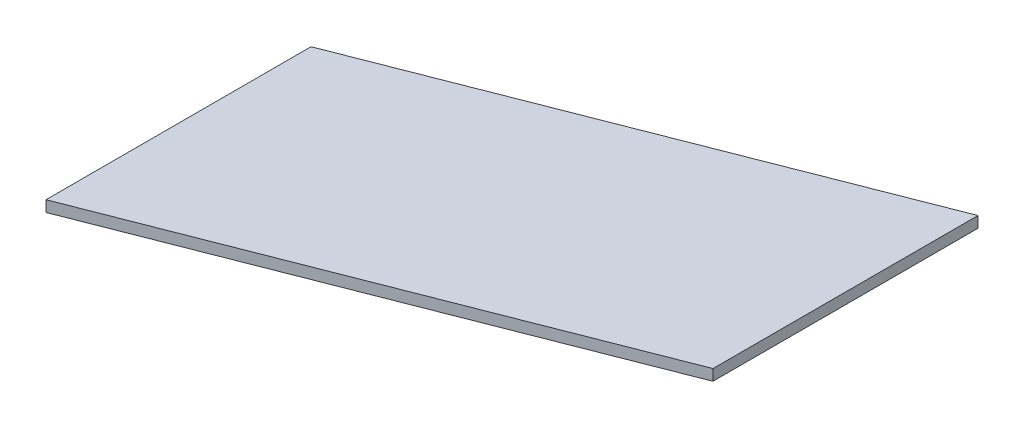
ISO-10303-21;
HEADER;
FILE_DESCRIPTION(('STEP AP214'),'2;1');
FILE_NAME('part.step','',(''),(''),'','','');
FILE_SCHEMA(('AUTOMOTIVE_DESIGN { 1 0 10303 214 1 1 1 1 }'));
ENDSEC;
DATA;
#1=APPLICATION_CONTEXT('core data for automotive mechanical design processes');
#2=APPLICATION_PROTOCOL_DEFINITION('international standard','automotive_design',2000,#1);
#3=PRODUCT_CONTEXT('',#1,'mechanical');
#4=PRODUCT('Part','Part','',(#3));
#5=PRODUCT_RELATED_PRODUCT_CATEGORY('part','',(#4));
#6=PRODUCT_DEFINITION_FORMATION('','',#4);
#7=PRODUCT_DEFINITION_CONTEXT('part definition',#1,'design');
#8=PRODUCT_DEFINITION('design','',#6,#7);
#9=PRODUCT_DEFINITION_SHAPE('','',#8);
#10=(LENGTH_UNIT() NAMED_UNIT(*) SI_UNIT(.MILLI.,.METRE.));
#11=(NAMED_UNIT(*) PLANE_ANGLE_UNIT() SI_UNIT($,.RADIAN.));
#12=(NAMED_UNIT(*) SI_UNIT($,.STERADIAN.) SOLID_ANGLE_UNIT());
#13=UNCERTAINTY_MEASURE_WITH_UNIT(LENGTH_MEASURE(1.E-05),#10,'distance_accuracy_value','');
#14=(GEOMETRIC_REPRESENTATION_CONTEXT(3) GLOBAL_UNCERTAINTY_ASSIGNED_CONTEXT((#13)) GLOBAL_UNIT_ASSIGNED_CONTEXT((#10,
#11,#12)) REPRESENTATION_CONTEXT('',''));
#15=CARTESIAN_POINT('',(0.,0.,0.));
#16=DIRECTION('',(0.,0.,1.));
#17=DIRECTION('',(1.,0.,0.));
#18=AXIS2_PLACEMENT_3D('',#15,#16,#17);
#19=CARTESIAN_POINT('',(0.,3.175,0.));
#20=DIRECTION('',(-0.363687728181226,0.,-0.931520926426443));
#21=DIRECTION('',(-0.931520926426443,0.,0.363687728181226));
#22=AXIS2_PLACEMENT_3D('',#19,#20,#21);
#23=PLANE('',#22);
#24=DIRECTION('',(0.931520926426443,0.,-0.363687728181226));
#25=VECTOR('',#24,1.);
#26=CARTESIAN_POINT('',(0.,0.,0.));
#27=LINE('',#26,#25);
#28=CARTESIAN_POINT('',(0.,0.,0.));
#29=VERTEX_POINT('',#28);
#30=CARTESIAN_POINT('',(137.922,0.,-53.848));
#31=VERTEX_POINT('',#30);
#32=EDGE_CURVE('E98',#29,#31,#27,.T.);
#33=ORIENTED_EDGE('',*,*,#32,.T.);
#34=DIRECTION('',(0.,-1.,0.));
#35=VECTOR('',#34,1.);
#36=CARTESIAN_POINT('',(137.922,3.175,-53.848));
#37=LINE('',#36,#35);
#38=CARTESIAN_POINT('',(137.922,3.175,-53.848));
#39=VERTEX_POINT('',#38);
#40=EDGE_CURVE('E11',#39,#31,#37,.T.);
#41=ORIENTED_EDGE('',*,*,#40,.F.);
#42=DIRECTION('',(0.931520926426443,0.,-0.363687728181226));
#43=VECTOR('',#42,1.);
#44=CARTESIAN_POINT('',(0.,3.175,0.));
#45=LINE('',#44,#43);
#46=CARTESIAN_POINT('',(0.,3.175,0.));
#47=VERTEX_POINT('',#46);
#48=EDGE_CURVE('E86',#47,#39,#45,.T.);
#49=ORIENTED_EDGE('',*,*,#48,.F.);
#50=DIRECTION('',(0.,-1.,0.));
#51=VECTOR('',#50,1.);
#52=CARTESIAN_POINT('',(0.,3.175,0.));
#53=LINE('',#52,#51);
#54=EDGE_CURVE('E94',#47,#29,#53,.T.);
#55=ORIENTED_EDGE('',*,*,#54,.T.);
#56=EDGE_LOOP('',(#33,#41,#49,#55));
#57=FACE_BOUND('',#56,.T.);
#58=ADVANCED_FACE('F35',(#57),#23,.F.);
#59=CARTESIAN_POINT('',(137.922,3.175,-53.848));
#60=DIRECTION('',(-1.,0.,0.));
#61=DIRECTION('',(0.,0.,1.));
#62=AXIS2_PLACEMENT_3D('',#59,#60,#61);
#63=PLANE('',#62);
#64=DIRECTION('',(0.,0.,-1.));
#65=VECTOR('',#64,1.);
#66=CARTESIAN_POINT('',(137.922,0.,-53.848));
#67=LINE('',#66,#65);
#68=CARTESIAN_POINT('',(137.922,0.,-130.048));
#69=VERTEX_POINT('',#68);
#70=EDGE_CURVE('E90',#31,#69,#67,.T.);
#71=ORIENTED_EDGE('',*,*,#70,.T.);
#72=DIRECTION('',(0.,-1.,0.));
#73=VECTOR('',#72,1.);
#74=CARTESIAN_POINT('',(137.922,3.175,-130.048));
#75=LINE('',#74,#73);
#76=CARTESIAN_POINT('',(137.922,3.175,-130.048));
#77=VERTEX_POINT('',#76);
#78=EDGE_CURVE('E43',#77,#69,#75,.T.);
#79=ORIENTED_EDGE('',*,*,#78,.F.);
#80=DIRECTION('',(0.,0.,-1.));
#81=VECTOR('',#80,1.);
#82=CARTESIAN_POINT('',(137.922,3.175,-53.848));
#83=LINE('',#82,#81);
#84=EDGE_CURVE('E81',#39,#77,#83,.T.);
#85=ORIENTED_EDGE('',*,*,#84,.F.);
#86=ORIENTED_EDGE('',*,*,#40,.T.);
#87=EDGE_LOOP('',(#71,#79,#85,#86));
#88=FACE_BOUND('',#87,.T.);
#89=ADVANCED_FACE('F89',(#88),#63,.F.);
#90=CARTESIAN_POINT('',(0.,3.175,-76.2));
#91=DIRECTION('',(0.363687728181226,0.,0.931520926426443));
#92=DIRECTION('',(0.931520926426443,0.,-0.363687728181226));
#93=AXIS2_PLACEMENT_3D('',#90,#91,#92);
#94=PLANE('',#93);
#95=DIRECTION('',(-0.931520926426443,0.,0.363687728181226));
#96=VECTOR('',#95,1.);
#97=CARTESIAN_POINT('',(0.,0.,-76.2));
#98=LINE('',#97,#96);
#99=CARTESIAN_POINT('',(0.,0.,-76.2));
#100=VERTEX_POINT('',#99);
#101=EDGE_CURVE('E68',#69,#100,#98,.T.);
#102=ORIENTED_EDGE('',*,*,#101,.T.);
#103=DIRECTION('',(0.,-1.,0.));
#104=VECTOR('',#103,1.);
#105=CARTESIAN_POINT('',(0.,3.175,-76.2));
#106=LINE('',#105,#104);
#107=CARTESIAN_POINT('',(0.,3.175,-76.2));
#108=VERTEX_POINT('',#107);
#109=EDGE_CURVE('E91',#108,#100,#106,.T.);
#110=ORIENTED_EDGE('',*,*,#109,.F.);
#111=DIRECTION('',(-0.931520926426443,0.,0.363687728181226));
#112=VECTOR('',#111,1.);
#113=CARTESIAN_POINT('',(0.,3.175,-76.2));
#114=LINE('',#113,#112);
#115=EDGE_CURVE('E84',#77,#108,#114,.T.);
#116=ORIENTED_EDGE('',*,*,#115,.F.);
#117=ORIENTED_EDGE('',*,*,#78,.T.);
#118=EDGE_LOOP('',(#102,#110,#116,#117));
#119=FACE_BOUND('',#118,.T.);
#120=ADVANCED_FACE('F92',(#119),#94,.F.);
#121=CARTESIAN_POINT('',(0.,3.175,0.));
#122=DIRECTION('',(1.,0.,0.));
#123=DIRECTION('',(0.,0.,-1.));
#124=AXIS2_PLACEMENT_3D('',#121,#122,#123);
#125=PLANE('',#124);
#126=DIRECTION('',(0.,0.,1.));
#127=VECTOR('',#126,1.);
#128=CARTESIAN_POINT('',(0.,0.,0.));
#129=LINE('',#128,#127);
#130=EDGE_CURVE('E74',#100,#29,#129,.T.);
#131=ORIENTED_EDGE('',*,*,#130,.T.);
#132=ORIENTED_EDGE('',*,*,#54,.F.);
#133=DIRECTION('',(0.,0.,1.));
#134=VECTOR('',#133,1.);
#135=CARTESIAN_POINT('',(0.,3.175,0.));
#136=LINE('',#135,#134);
#137=EDGE_CURVE('E51',#108,#47,#136,.T.);
#138=ORIENTED_EDGE('',*,*,#137,.F.);
#139=ORIENTED_EDGE('',*,*,#109,.T.);
#140=EDGE_LOOP('',(#131,#132,#138,#139));
#141=FACE_BOUND('',#140,.T.);
#142=ADVANCED_FACE('F105',(#141),#125,.F.);
#143=CARTESIAN_POINT('',(0.,3.175,0.));
#144=DIRECTION('',(0.,1.,0.));
#145=DIRECTION('',(0.,0.,1.));
#146=AXIS2_PLACEMENT_3D('',#143,#144,#145);
#147=PLANE('',#146);
#148=ORIENTED_EDGE('',*,*,#48,.T.);
#149=ORIENTED_EDGE('',*,*,#84,.T.);
#150=ORIENTED_EDGE('',*,*,#115,.T.);
#151=ORIENTED_EDGE('',*,*,#137,.T.);
#152=EDGE_LOOP('',(#148,#149,#150,#151));
#153=FACE_BOUND('',#152,.T.);
#154=ADVANCED_FACE('F82',(#153),#147,.T.);
#155=CARTESIAN_POINT('',(0.,0.,0.));
#156=DIRECTION('',(0.,1.,0.));
#157=DIRECTION('',(0.,0.,1.));
#158=AXIS2_PLACEMENT_3D('',#155,#156,#157);
#159=PLANE('',#158);
#160=ORIENTED_EDGE('',*,*,#32,.F.);
#161=ORIENTED_EDGE('',*,*,#130,.F.);
#162=ORIENTED_EDGE('',*,*,#101,.F.);
#163=ORIENTED_EDGE('',*,*,#70,.F.);
#164=EDGE_LOOP('',(#160,#161,#162,#163));
#165=FACE_BOUND('',#164,.T.);
#166=ADVANCED_FACE('F108',(#165),#159,.F.);
#167=CLOSED_SHELL('',(#58,#89,#120,#142,#154,#166));
#168=MANIFOLD_SOLID_BREP('B2',#167);
#169=ADVANCED_BREP_SHAPE_REPRESENTATION('',(#18,#168),#14);
#170=SHAPE_DEFINITION_REPRESENTATION(#9,#169);
ENDSEC;
END-ISO-10303-21;
